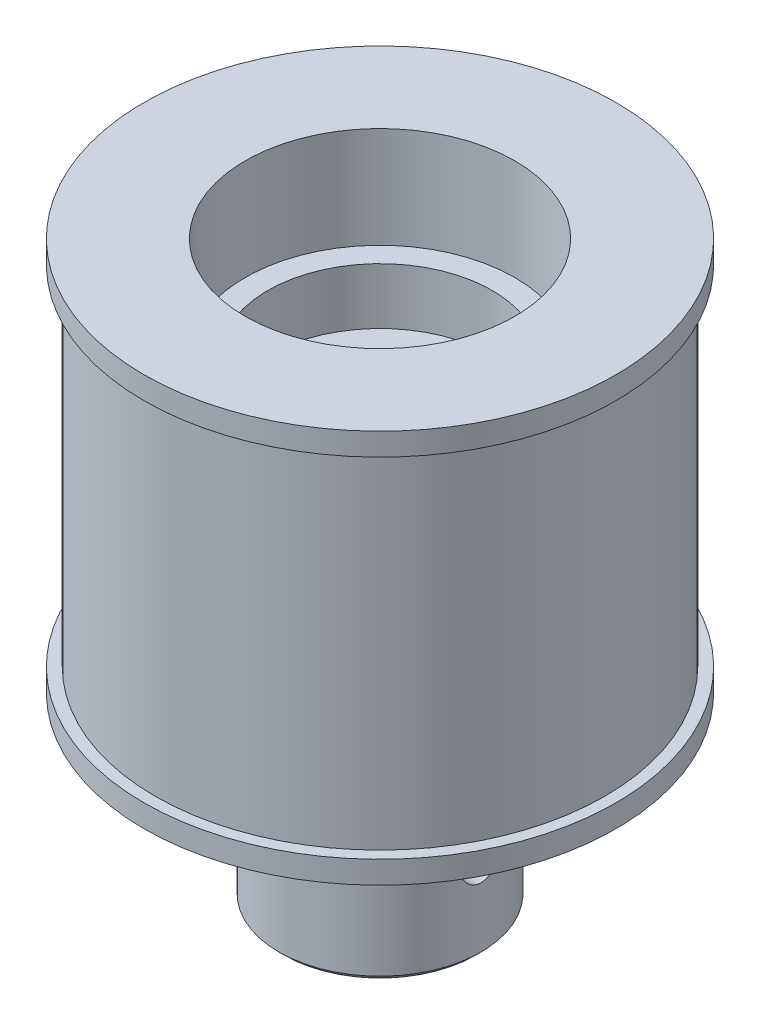
ISO-10303-21;
HEADER;
FILE_DESCRIPTION(('STEP AP214'),'2;1');
FILE_NAME('part.step','',(''),(''),'','','');
FILE_SCHEMA(('AUTOMOTIVE_DESIGN { 1 0 10303 214 1 1 1 1 }'));
ENDSEC;
DATA;
#1=APPLICATION_CONTEXT('core data for automotive mechanical design processes');
#2=APPLICATION_PROTOCOL_DEFINITION('international standard','automotive_design',2000,#1);
#3=PRODUCT_CONTEXT('',#1,'mechanical');
#4=PRODUCT('Part','Part','',(#3));
#5=PRODUCT_RELATED_PRODUCT_CATEGORY('part','',(#4));
#6=PRODUCT_DEFINITION_FORMATION('','',#4);
#7=PRODUCT_DEFINITION_CONTEXT('part definition',#1,'design');
#8=PRODUCT_DEFINITION('design','',#6,#7);
#9=PRODUCT_DEFINITION_SHAPE('','',#8);
#10=(LENGTH_UNIT() NAMED_UNIT(*) SI_UNIT(.MILLI.,.METRE.));
#11=(NAMED_UNIT(*) PLANE_ANGLE_UNIT() SI_UNIT($,.RADIAN.));
#12=(NAMED_UNIT(*) SI_UNIT($,.STERADIAN.) SOLID_ANGLE_UNIT());
#13=UNCERTAINTY_MEASURE_WITH_UNIT(LENGTH_MEASURE(1.E-05),#10,'distance_accuracy_value','');
#14=(GEOMETRIC_REPRESENTATION_CONTEXT(3) GLOBAL_UNCERTAINTY_ASSIGNED_CONTEXT((#13)) GLOBAL_UNIT_ASSIGNED_CONTEXT((#10,
#11,#12)) REPRESENTATION_CONTEXT('',''));
#15=CARTESIAN_POINT('',(0.,0.,0.));
#16=DIRECTION('',(0.,0.,1.));
#17=DIRECTION('',(1.,0.,0.));
#18=AXIS2_PLACEMENT_3D('',#15,#16,#17);
#19=CARTESIAN_POINT('',(3.70685397720562E-08,-63.6879775965787,3.94408852499265E-08));
#20=DIRECTION('',(0.,-1.,0.));
#21=DIRECTION('',(0.,0.,-1.));
#22=AXIS2_PLACEMENT_3D('',#19,#20,#21);
#23=CYLINDRICAL_SURFACE('',#22,7.99999999999998);
#24=CARTESIAN_POINT('',(7.28766084146934,-48.6879775965787,3.30000003944086));
#25=CARTESIAN_POINT('',(7.28766168684549,-48.5998412091458,3.29999912533101));
#26=CARTESIAN_POINT('',(7.28926702489455,-48.5116681297829,3.29646158001995));
#27=CARTESIAN_POINT('',(7.29562606450204,-48.3359838307674,3.28236025662656));
#28=CARTESIAN_POINT('',(7.30038184761695,-48.2484730874232,3.27179183309513));
#29=CARTESIAN_POINT('',(7.31919460655789,-47.9875669606284,3.22961619820375));
#30=CARTESIAN_POINT('',(7.33779634133791,-47.8160571252773,3.18753899617591));
#31=CARTESIAN_POINT('',(7.38462377085963,-47.4839281651399,3.07747096482155));
#32=CARTESIAN_POINT('',(7.41281071755744,-47.3232682659154,3.00958434122854));
#33=CARTESIAN_POINT('',(7.47556538066111,-47.0156257502108,2.85013069755427));
#34=CARTESIAN_POINT('',(7.51013149848159,-46.8686397209829,2.75856960786439));
#35=CARTESIAN_POINT('',(7.58411043022314,-46.5835168334857,2.548397180833));
#36=CARTESIAN_POINT('',(7.62368553340776,-46.4463181759618,2.42857040845044));
#37=CARTESIAN_POINT('',(7.70188736321158,-46.1932689621633,2.16782147856657));
#38=CARTESIAN_POINT('',(7.74051372355154,-46.077426541958,2.02689131822568));
#39=CARTESIAN_POINT('',(7.81443152134191,-45.8656345951317,1.72060392781853));
#40=CARTESIAN_POINT('',(7.84951236673556,-45.7707356619456,1.55446481998653));
#41=CARTESIAN_POINT('',(7.91040570382046,-45.6106373751258,1.20687276287427));
#42=CARTESIAN_POINT('',(7.93622223126295,-45.5454250859699,1.02542652438377));
#43=CARTESIAN_POINT('',(7.97452810355379,-45.4499361661065,0.662210384128631));
#44=CARTESIAN_POINT('',(7.98763132352917,-45.4180438961445,0.480931289830983));
#45=CARTESIAN_POINT('',(8.00126126858232,-45.3848842974542,0.115152749719518));
#46=CARTESIAN_POINT('',(8.00179298796317,-45.3836048071284,-0.069345388106527));
#47=CARTESIAN_POINT('',(7.99058452020967,-45.4108505877294,-0.424594722345897));
#48=CARTESIAN_POINT('',(7.97957470474195,-45.4376019637119,-0.595509291358458));
#49=CARTESIAN_POINT('',(7.94751855760714,-45.5171152317752,-0.930171651031102));
#50=CARTESIAN_POINT('',(7.92647148686588,-45.5698790392416,-1.09391891297067));
#51=CARTESIAN_POINT('',(7.87597819169302,-45.7005529199363,-1.41259117419297));
#52=CARTESIAN_POINT('',(7.84640898138566,-45.7788335764051,-1.56734392008314));
#53=CARTESIAN_POINT('',(7.78177531229409,-45.9579601549752,-1.86192094054493));
#54=CARTESIAN_POINT('',(7.74670892594815,-46.0588139975958,-2.00173994964075));
#55=CARTESIAN_POINT('',(7.67174270983388,-46.2883540746247,-2.27277057949669));
#56=CARTESIAN_POINT('',(7.6316763277963,-46.4184844183562,-2.40271488691971));
#57=CARTESIAN_POINT('',(7.5530628928937,-46.6987969292418,-2.63947672904125));
#58=CARTESIAN_POINT('',(7.51451640746516,-46.8489864951738,-2.74628569204907));
#59=CARTESIAN_POINT('',(7.44213217968692,-47.1711744036148,-2.93690675741546));
#60=CARTESIAN_POINT('',(7.40848219475641,-47.3437127397235,-3.01988354657748));
#61=CARTESIAN_POINT('',(7.35192773524196,-47.7020709391428,-3.15509012293198));
#62=CARTESIAN_POINT('',(7.32901575798925,-47.8878814242534,-3.20734138463683));
#63=CARTESIAN_POINT('',(7.29838187177342,-48.2548233870004,-3.27642636771665));
#64=CARTESIAN_POINT('',(7.28978226063255,-48.4354941989582,-3.29531134966309));
#65=CARTESIAN_POINT('',(7.28623964456051,-48.797588855962,-3.30314199400526));
#66=CARTESIAN_POINT('',(7.29129206918439,-48.9790124286936,-3.29209767616441));
#67=CARTESIAN_POINT('',(7.3135789244228,-49.325579614681,-3.24225417059817));
#68=CARTESIAN_POINT('',(7.33003611431017,-49.491033955929,-3.20522400293071));
#69=CARTESIAN_POINT('',(7.3722922953943,-49.8132517253374,-3.10679156579863));
#70=CARTESIAN_POINT('',(7.39809344131328,-49.9700131392808,-3.04538367450106));
#71=CARTESIAN_POINT('',(7.45744959423464,-50.2777356079711,-2.89707800465932));
#72=CARTESIAN_POINT('',(7.49128431808843,-50.4281779861409,-2.80921954672569));
#73=CARTESIAN_POINT('',(7.56249050086479,-50.7128979354344,-2.61146906874681));
#74=CARTESIAN_POINT('',(7.59986346482042,-50.8471685720353,-2.50156765002805));
#75=CARTESIAN_POINT('',(7.67752027048328,-51.1068368494868,-2.25255080380618));
#76=CARTESIAN_POINT('',(7.71779938142686,-51.230681070733,-2.11180770311287));
#77=CARTESIAN_POINT('',(7.79396233315651,-51.4532633078459,-1.81059592069962));
#78=CARTESIAN_POINT('',(7.82984588967138,-51.5519997003721,-1.65012596453925));
#79=CARTESIAN_POINT('',(7.89337538492814,-51.7213858652055,-1.31303359439945));
#80=CARTESIAN_POINT('',(7.92100631665157,-51.791984547381,-1.1363825085758));
#81=CARTESIAN_POINT('',(7.96474211940721,-51.9019609094997,-0.77228162749393));
#82=CARTESIAN_POINT('',(7.98085369785974,-51.9413567594847,-0.584838185166113));
#83=CARTESIAN_POINT('',(7.99897789724173,-51.9855540571871,-0.218374340606245));
#84=CARTESIAN_POINT('',(8.00188350658962,-51.9925472640615,-0.039660580255623));
#85=CARTESIAN_POINT('',(7.99572444083135,-51.9776067178408,0.316323521290345));
#86=CARTESIAN_POINT('',(7.98666179117198,-51.9556778593688,0.493594101614116));
#87=CARTESIAN_POINT('',(7.9580483374852,-51.8850883482519,0.835410778877292));
#88=CARTESIAN_POINT('',(7.938867329054,-51.8373688443411,1.00018473703276));
#89=CARTESIAN_POINT('',(7.892109641997,-51.7175692348018,1.31933479658177));
#90=CARTESIAN_POINT('',(7.86453135250536,-51.6454844548453,1.47370889600611));
#91=CARTESIAN_POINT('',(7.8021162595224,-51.4753690575081,1.775322128978));
#92=CARTESIAN_POINT('',(7.76700871637184,-51.3763170423559,1.92192779031539));
#93=CARTESIAN_POINT('',(7.69371402925846,-51.1565699429651,2.19705936094854));
#94=CARTESIAN_POINT('',(7.6555257731865,-51.0358670235366,2.32557869488281));
#95=CARTESIAN_POINT('',(7.57719566284719,-50.7668103556422,2.56975273508921));
#96=CARTESIAN_POINT('',(7.53709262648674,-50.617152147218,2.68398499729813));
#97=CARTESIAN_POINT('',(7.46210533098938,-50.2994155646953,2.88593993938718));
#98=CARTESIAN_POINT('',(7.42722396163788,-50.1313270793633,2.97364796736153));
#99=CARTESIAN_POINT('',(7.38230252025306,-49.8694101079418,3.08271465035157));
#100=CARTESIAN_POINT('',(7.36858886721319,-49.7807224037907,3.11526403705097));
#101=CARTESIAN_POINT('',(7.34403273115054,-49.6005337974875,3.17272203759876));
#102=CARTESIAN_POINT('',(7.33318884586417,-49.5090342937598,3.19763438410395));
#103=CARTESIAN_POINT('',(7.31479998694532,-49.3241699185096,3.23947881547502));
#104=CARTESIAN_POINT('',(7.30724629946075,-49.2308106675112,3.2564319890333));
#105=CARTESIAN_POINT('',(7.29569187595335,-49.0428088313693,3.28223758836641));
#106=CARTESIAN_POINT('',(7.29168836222304,-48.9481673084663,3.29109634749383));
#107=CARTESIAN_POINT('',(7.28891154033444,-48.8257883124827,3.297236697422));
#108=CARTESIAN_POINT('',(7.28844283465011,-48.798239490268,3.29827264797827));
#109=CARTESIAN_POINT('',(7.28781735185684,-48.7431208413996,3.29965446446151));
#110=CARTESIAN_POINT('',(7.2876605769939,-48.7155510145961,3.3000003254196));
#111=CARTESIAN_POINT('',(7.28766084146934,-48.6879775965787,3.30000003944086));
#112=B_SPLINE_CURVE_WITH_KNOTS('',3,(#24,#25,#26,#27,#28,#29,#30,#31,#32,#33,#34,#35,#36,#37,
#38,#39,#40,#41,#42,#43,#44,#45,#46,#47,#48,#49,#50,#51,#52,#53,#54,#55,#56,#57,#58,#59,#60,#61,
#62,#63,#64,#65,#66,#67,#68,#69,#70,#71,#72,#73,#74,#75,#76,#77,#78,#79,#80,#81,#82,#83,#84,#85,
#86,#87,#88,#89,#90,#91,#92,#93,#94,#95,#96,#97,#98,#99,#100,#101,#102,#103,#104,#105,#106,#107,
#108,#109,#110,#111),.UNSPECIFIED.,.T.,.F.,(4,2,2,2,2,2,2,2,2,2,2,2,2,2,2,2,2,2,2,2,2,2,2,2,2,2,
2,2,2,2,2,2,2,2,2,2,2,2,2,2,2,2,2,4),(0.,0.26437796609069,0.528930785979015,1.0588042546947,
1.58656069240161,2.11418505637261,2.67097328187332,3.22797319018168,3.80856885855565,
4.38891129811146,4.93958366154288,5.49003725467795,6.00764527305279,6.52529141039329,
7.05081787515226,7.57652902744837,8.13865959961875,8.70099808737194,9.28114346214908,
9.86088288157655,10.4035480507196,10.9460315682752,11.4547737572776,11.9636333373319,
12.4938256760685,13.0242445605368,13.5968210824413,14.1694346147316,14.7430831658777,
15.3163974237373,15.8503041672759,16.384120566753,16.8996563852295,17.4152911622621,
17.9541243838482,18.4931529972604,19.0680018488106,19.6431676674999,19.9292334658526,
20.2151592238064,20.5003230541709,20.7852635708517,20.8679734696513,20.9506839639879),.UNSPECIFIED.);
#113=CARTESIAN_POINT('',(7.28766084146934,-48.6879775965787,3.30000003944086));
#114=VERTEX_POINT('',#113);
#115=EDGE_CURVE('E60',#114,#114,#112,.T.);
#116=ORIENTED_EDGE('',*,*,#115,.F.);
#117=EDGE_LOOP('',(#116));
#118=FACE_BOUND('',#117,.T.);
#119=CARTESIAN_POINT('',(-7.28766076733226,-48.6879775965787,3.30000003944086));
#120=CARTESIAN_POINT('',(-7.28766161270841,-48.7761139840115,3.29999912533101));
#121=CARTESIAN_POINT('',(-7.28926695075747,-48.8642870633745,3.29646158001995));
#122=CARTESIAN_POINT('',(-7.29562599036496,-49.0399713623899,3.28236025662656));
#123=CARTESIAN_POINT('',(-7.30038177347987,-49.1274821057341,3.27179183309514));
#124=CARTESIAN_POINT('',(-7.31919453242081,-49.3883882325289,3.22961619820375));
#125=CARTESIAN_POINT('',(-7.33779626720083,-49.5598980678801,3.18753899617591));
#126=CARTESIAN_POINT('',(-7.38462369672255,-49.8920270280174,3.07747096482155));
#127=CARTESIAN_POINT('',(-7.41281064342036,-50.052686927242,3.00958434122854));
#128=CARTESIAN_POINT('',(-7.47556530652403,-50.3603294429465,2.85013069755427));
#129=CARTESIAN_POINT('',(-7.51013142434451,-50.5073154721744,2.75856960786439));
#130=CARTESIAN_POINT('',(-7.58411035608606,-50.7924383596717,2.548397180833));
#131=CARTESIAN_POINT('',(-7.62368545927068,-50.9296370171956,2.42857040845044));
#132=CARTESIAN_POINT('',(-7.7018872890745,-51.1826862309941,2.16782147856657));
#133=CARTESIAN_POINT('',(-7.74051364941446,-51.2985286511994,2.02689131822568));
#134=CARTESIAN_POINT('',(-7.81443144720483,-51.5103205980256,1.72060392781853));
#135=CARTESIAN_POINT('',(-7.84951229259848,-51.6052195312117,1.55446481998653));
#136=CARTESIAN_POINT('',(-7.91040562968338,-51.7653178180315,1.20687276287427));
#137=CARTESIAN_POINT('',(-7.93622215712587,-51.8305301071875,1.02542652438377));
#138=CARTESIAN_POINT('',(-7.97452802941671,-51.9260190270508,0.662210384128631));
#139=CARTESIAN_POINT('',(-7.98763124939209,-51.9579112970128,0.480931289830983));
#140=CARTESIAN_POINT('',(-8.00126119444524,-51.9910708957031,0.115152749719518));
#141=CARTESIAN_POINT('',(-8.00179291382609,-51.992350386029,-0.0693453881065269));
#142=CARTESIAN_POINT('',(-7.99058444607259,-51.9651046054279,-0.424594722345897));
#143=CARTESIAN_POINT('',(-7.97957463060488,-51.9383532294455,-0.595509291358459));
#144=CARTESIAN_POINT('',(-7.94751848347006,-51.8588399613821,-0.930171651031103));
#145=CARTESIAN_POINT('',(-7.92647141272881,-51.8060761539158,-1.09391891297067));
#146=CARTESIAN_POINT('',(-7.87597811755594,-51.6754022732211,-1.41259117419297));
#147=CARTESIAN_POINT('',(-7.84640890724858,-51.5971216167522,-1.56734392008314));
#148=CARTESIAN_POINT('',(-7.78177523815701,-51.4179950381821,-1.86192094054493));
#149=CARTESIAN_POINT('',(-7.74670885181107,-51.3171411955615,-2.00173994964075));
#150=CARTESIAN_POINT('',(-7.6717426356968,-51.0876011185327,-2.27277057949669));
#151=CARTESIAN_POINT('',(-7.63167625365922,-50.9574707748012,-2.40271488691971));
#152=CARTESIAN_POINT('',(-7.55306281875662,-50.6771582639156,-2.63947672904125));
#153=CARTESIAN_POINT('',(-7.51451633332808,-50.5269686979835,-2.74628569204907));
#154=CARTESIAN_POINT('',(-7.44213210554984,-50.2047807895426,-2.93690675741546));
#155=CARTESIAN_POINT('',(-7.40848212061933,-50.0322424534338,-3.01988354657748));
#156=CARTESIAN_POINT('',(-7.35192766110488,-49.6738842540145,-3.15509012293198));
#157=CARTESIAN_POINT('',(-7.32901568385217,-49.488073768904,-3.20734138463683));
#158=CARTESIAN_POINT('',(-7.29838179763634,-49.1211318061569,-3.27642636771665));
#159=CARTESIAN_POINT('',(-7.28978218649547,-48.9404609941991,-3.29531134966309));
#160=CARTESIAN_POINT('',(-7.28623957042343,-48.5783663371953,-3.30314199400526));
#161=CARTESIAN_POINT('',(-7.29129199504731,-48.3969427644638,-3.29209767616441));
#162=CARTESIAN_POINT('',(-7.31357885028572,-48.0503755784763,-3.24225417059817));
#163=CARTESIAN_POINT('',(-7.33003604017309,-47.8849212372283,-3.20522400293071));
#164=CARTESIAN_POINT('',(-7.37229222125722,-47.5627034678199,-3.10679156579863));
#165=CARTESIAN_POINT('',(-7.3980933671762,-47.4059420538765,-3.04538367450106));
#166=CARTESIAN_POINT('',(-7.45744952009755,-47.0982195851862,-2.89707800465932));
#167=CARTESIAN_POINT('',(-7.49128424395135,-46.9477772070165,-2.80921954672569));
#168=CARTESIAN_POINT('',(-7.56249042672771,-46.6630572577229,-2.61146906874681));
#169=CARTESIAN_POINT('',(-7.59986339068334,-46.5287866211221,-2.50156765002804));
#170=CARTESIAN_POINT('',(-7.6775201963462,-46.2691183436705,-2.25255080380618));
#171=CARTESIAN_POINT('',(-7.71779930728979,-46.1452741224243,-2.11180770311287));
#172=CARTESIAN_POINT('',(-7.79396225901943,-45.9226918853115,-1.81059592069962));
#173=CARTESIAN_POINT('',(-7.8298458155343,-45.8239554927852,-1.65012596453925));
#174=CARTESIAN_POINT('',(-7.89337531079106,-45.6545693279518,-1.31303359439945));
#175=CARTESIAN_POINT('',(-7.92100624251449,-45.5839706457763,-1.1363825085758));
#176=CARTESIAN_POINT('',(-7.96474204527013,-45.4739942836577,-0.77228162749393));
#177=CARTESIAN_POINT('',(-7.98085362372266,-45.4345984336726,-0.584838185166113));
#178=CARTESIAN_POINT('',(-7.99897782310465,-45.3904011359702,-0.218374340606244));
#179=CARTESIAN_POINT('',(-8.00188343245254,-45.3834079290959,-0.0396605802556225));
#180=CARTESIAN_POINT('',(-7.99572436669427,-45.3983484753165,0.316323521290345));
#181=CARTESIAN_POINT('',(-7.9866617170349,-45.4202773337886,0.493594101614117));
#182=CARTESIAN_POINT('',(-7.95804826334813,-45.4908668449054,0.835410778877292));
#183=CARTESIAN_POINT('',(-7.93886725491692,-45.5385863488163,1.00018473703276));
#184=CARTESIAN_POINT('',(-7.89210956785992,-45.6583859583555,1.31933479658177));
#185=CARTESIAN_POINT('',(-7.86453127836828,-45.730470738312,1.47370889600611));
#186=CARTESIAN_POINT('',(-7.80211618538532,-45.9005861356492,1.775322128978));
#187=CARTESIAN_POINT('',(-7.76700864223476,-45.9996381508015,1.92192779031538));
#188=CARTESIAN_POINT('',(-7.69371395512138,-46.2193852501923,2.19705936094854));
#189=CARTESIAN_POINT('',(-7.65552569904942,-46.3400881696208,2.32557869488281));
#190=CARTESIAN_POINT('',(-7.57719558871011,-46.6091448375151,2.56975273508921));
#191=CARTESIAN_POINT('',(-7.53709255234966,-46.7588030459394,2.68398499729813));
#192=CARTESIAN_POINT('',(-7.4621052568523,-47.076539628462,2.88593993938718));
#193=CARTESIAN_POINT('',(-7.4272238875008,-47.244628113794,2.97364796736153));
#194=CARTESIAN_POINT('',(-7.38230244611598,-47.5065450852155,3.08271465035157));
#195=CARTESIAN_POINT('',(-7.36858879307611,-47.5952327893666,3.11526403705097));
#196=CARTESIAN_POINT('',(-7.34403265701346,-47.7754213956698,3.17272203759876));
#197=CARTESIAN_POINT('',(-7.33318877172709,-47.8669208993976,3.19763438410395));
#198=CARTESIAN_POINT('',(-7.31479991280824,-48.0517852746477,3.23947881547502));
#199=CARTESIAN_POINT('',(-7.30724622532367,-48.1451445256461,3.2564319890333));
#200=CARTESIAN_POINT('',(-7.29569180181627,-48.3331463617881,3.28223758836641));
#201=CARTESIAN_POINT('',(-7.29168828808596,-48.427787884691,3.29109634749383));
#202=CARTESIAN_POINT('',(-7.28891146619736,-48.5501668806746,3.297236697422));
#203=CARTESIAN_POINT('',(-7.28844276051303,-48.5777157028893,3.29827264797827));
#204=CARTESIAN_POINT('',(-7.28781727771975,-48.6328343517578,3.29965446446151));
#205=CARTESIAN_POINT('',(-7.28766050285682,-48.6604041785613,3.3000003254196));
#206=CARTESIAN_POINT('',(-7.28766076733226,-48.6879775965787,3.30000003944086));
#207=B_SPLINE_CURVE_WITH_KNOTS('',3,(#119,#120,#121,#122,#123,#124,#125,#126,#127,#128,#129,
#130,#131,#132,#133,#134,#135,#136,#137,#138,#139,#140,#141,#142,#143,#144,#145,#146,#147,#148,
#149,#150,#151,#152,#153,#154,#155,#156,#157,#158,#159,#160,#161,#162,#163,#164,#165,#166,#167,
#168,#169,#170,#171,#172,#173,#174,#175,#176,#177,#178,#179,#180,#181,#182,#183,#184,#185,#186,
#187,#188,#189,#190,#191,#192,#193,#194,#195,#196,#197,#198,#199,#200,#201,#202,#203,#204,#205,
#206),.UNSPECIFIED.,.T.,.F.,(4,2,2,2,2,2,2,2,2,2,2,2,2,2,2,2,2,2,2,2,2,2,2,2,2,2,2,2,2,2,2,2,2,
2,2,2,2,2,2,2,2,2,2,4),(0.,0.264377966090676,0.528930785979001,1.0588042546947,1.58656069240161,
2.11418505637261,2.67097328187332,3.22797319018168,3.80856885855565,4.38891129811146,
4.93958366154288,5.49003725467795,6.00764527305279,6.52529141039329,7.05081787515226,
7.57652902744837,8.13865959961875,8.70099808737194,9.28114346214908,9.86088288157655,
10.4035480507196,10.9460315682752,11.4547737572776,11.963633337332,12.4938256760685,
13.0242445605368,13.5968210824413,14.1694346147316,14.7430831658777,15.3163974237373,
15.8503041672759,16.384120566753,16.8996563852295,17.4152911622621,17.9541243838482,
18.4931529972604,19.0680018488106,19.6431676674999,19.9292334658526,20.2151592238064,
20.5003230541709,20.7852635708517,20.8679734696513,20.9506839639879),.UNSPECIFIED.);
#208=CARTESIAN_POINT('',(-7.28766076733226,-48.6879775965787,3.30000003944086));
#209=VERTEX_POINT('',#208);
#210=EDGE_CURVE('E68',#209,#209,#207,.T.);
#211=ORIENTED_EDGE('',*,*,#210,.F.);
#212=EDGE_LOOP('',(#211));
#213=FACE_BOUND('',#212,.T.);
#214=CARTESIAN_POINT('',(3.70685397720562E-08,-62.6879775965787,3.94408852499265E-08));
#215=DIRECTION('',(0.,-1.,0.));
#216=DIRECTION('',(0.,0.,-1.));
#217=AXIS2_PLACEMENT_3D('',#214,#215,#216);
#218=CIRCLE('',#217,7.99999999999998);
#219=CARTESIAN_POINT('',(3.70685397720562E-08,-62.6879775965787,-7.99999996055909));
#220=VERTEX_POINT('',#219);
#221=EDGE_CURVE('E56',#220,#220,#218,.T.);
#222=ORIENTED_EDGE('',*,*,#221,.T.);
#223=EDGE_LOOP('',(#222));
#224=FACE_BOUND('',#223,.T.);
#225=CARTESIAN_POINT('',(3.70685397720562E-08,10.3120224034213,3.94408852499265E-08));
#226=DIRECTION('',(0.,1.,0.));
#227=DIRECTION('',(0.,0.,1.));
#228=AXIS2_PLACEMENT_3D('',#225,#226,#227);
#229=CIRCLE('',#228,7.99999999999998);
#230=CARTESIAN_POINT('',(3.70685397720562E-08,10.3120224034213,8.00000003944086));
#231=VERTEX_POINT('',#230);
#232=EDGE_CURVE('E43',#231,#231,#229,.F.);
#233=ORIENTED_EDGE('',*,*,#232,.F.);
#234=EDGE_LOOP('',(#233));
#235=FACE_BOUND('',#234,.T.);
#236=ADVANCED_FACE('F39',(#118,#213,#224,#235),#23,.F.);
#237=CARTESIAN_POINT('',(-87.2333386358344,-48.6879775965787,3.94408852499265E-08));
#238=DIRECTION('',(-1.,0.,0.));
#239=DIRECTION('',(0.,0.,1.));
#240=AXIS2_PLACEMENT_3D('',#237,#238,#239);
#241=CYLINDRICAL_SURFACE('',#240,3.29999999999998);
#242=ORIENTED_EDGE('',*,*,#115,.T.);
#243=EDGE_LOOP('',(#242));
#244=FACE_BOUND('',#243,.T.);
#245=CARTESIAN_POINT('',(17.6949145607389,-48.6879775965787,3.30000003944086));
#246=CARTESIAN_POINT('',(17.6949180749467,-48.5042941629642,3.29999291828668));
#247=CARTESIAN_POINT('',(17.6978057168288,-48.3205174508536,3.28461184258262));
#248=CARTESIAN_POINT('',(17.7090307113766,-47.9581407240295,3.22353231373032));
#249=CARTESIAN_POINT('',(17.7173727710361,-47.7795453197758,3.17780767451579));
#250=CARTESIAN_POINT('',(17.7385307639654,-47.4328271452147,3.05748789212024));
#251=CARTESIAN_POINT('',(17.7513426185429,-47.264694991441,2.98291906256927));
#252=CARTESIAN_POINT('',(17.7799918035156,-46.9433396642452,2.80709651430073));
#253=CARTESIAN_POINT('',(17.7958288761273,-46.7901152221919,2.70584506897105));
#254=CARTESIAN_POINT('',(17.8289546327218,-46.5010881033218,2.4782466309118));
#255=CARTESIAN_POINT('',(17.8462569958272,-46.3654886397261,2.35164353068142));
#256=CARTESIAN_POINT('',(17.8802428342595,-46.1173300543037,2.07748910449728));
#257=CARTESIAN_POINT('',(17.8969262697498,-46.0047724134416,1.92993643308564));
#258=CARTESIAN_POINT('',(17.9279406702824,-45.805117117726,1.61674022785813));
#259=CARTESIAN_POINT('',(17.9422536459368,-45.7182105598446,1.45097294035575));
#260=CARTESIAN_POINT('',(17.9667615083072,-45.573554957523,1.10688483397155));
#261=CARTESIAN_POINT('',(17.976956718691,-45.5158036213113,0.928565003049207));
#262=CARTESIAN_POINT('',(17.9919837179642,-45.4317248040995,0.56653828801584));
#263=CARTESIAN_POINT('',(17.9968738986674,-45.4050549650303,0.382913378451864));
#264=CARTESIAN_POINT('',(18.0009409768761,-45.3828299131646,0.0137345619020261));
#265=CARTESIAN_POINT('',(18.0001183403922,-45.3872721624684,-0.171819186510143));
#266=CARTESIAN_POINT('',(17.9928982278817,-45.4268816980366,-0.537242112820622));
#267=CARTESIAN_POINT('',(17.9865676329446,-45.4616803906076,-0.717152755907168));
#268=CARTESIAN_POINT('',(17.969117819197,-45.5604325793799,-1.06853722884088));
#269=CARTESIAN_POINT('',(17.9579984316032,-45.6243871031968,-1.24001076108074));
#270=CARTESIAN_POINT('',(17.9321081713838,-45.7799898618053,-1.57072829257839));
#271=CARTESIAN_POINT('',(17.917317825491,-45.8717863855525,-1.72990093511656));
#272=CARTESIAN_POINT('',(17.8857229153622,-46.0803582497431,-2.03072114646645));
#273=CARTESIAN_POINT('',(17.8689181550399,-46.1971360227724,-2.17236700646029));
#274=CARTESIAN_POINT('',(17.8348665055433,-46.4543894556154,-2.43629551506219));
#275=CARTESIAN_POINT('',(17.817616746619,-46.5951875306018,-2.55826373932653));
#276=CARTESIAN_POINT('',(17.7848554016286,-46.8954082499162,-2.77690086852963));
#277=CARTESIAN_POINT('',(17.7693438388382,-47.0548311435854,-2.87356943471118));
#278=CARTESIAN_POINT('',(17.7418115136186,-47.388181986961,-3.03894694954119));
#279=CARTESIAN_POINT('',(17.7297962591887,-47.5621322739435,-3.10761184948394));
#280=CARTESIAN_POINT('',(17.7107025841817,-47.919369714965,-3.21465404664483));
#281=CARTESIAN_POINT('',(17.7036236306697,-48.1026558587891,-3.25303461349081));
#282=CARTESIAN_POINT('',(17.6953090396132,-48.4705314927247,-3.2979630155672));
#283=CARTESIAN_POINT('',(17.6939906229817,-48.6550640878887,-3.3049618459968));
#284=CARTESIAN_POINT('',(17.6971250816561,-49.0226616691232,-3.28813556621438));
#285=CARTESIAN_POINT('',(17.7015776847566,-49.2057267240042,-3.26431190982645));
#286=CARTESIAN_POINT('',(17.7156755092993,-49.5637205138194,-3.18690354862873));
#287=CARTESIAN_POINT('',(17.7252797125559,-49.7387018196887,-3.13355383162204));
#288=CARTESIAN_POINT('',(17.7485634416195,-50.0772416582391,-2.99885647783831));
#289=CARTESIAN_POINT('',(17.7622432562055,-50.2407993804836,-2.91750685705345));
#290=CARTESIAN_POINT('',(17.7923261483781,-50.5538403522679,-2.72807541504294));
#291=CARTESIAN_POINT('',(17.8087576770316,-50.7031478935847,-2.61970783369335));
#292=CARTESIAN_POINT('',(17.8424118956867,-50.9816222884698,-2.37970339200737));
#293=CARTESIAN_POINT('',(17.8596346534661,-51.1107874124333,-2.24806453546351));
#294=CARTESIAN_POINT('',(17.8931959026866,-51.3469873910588,-1.96324335333799));
#295=CARTESIAN_POINT('',(17.9095203392852,-51.45371945872,-1.80980801374697));
#296=CARTESIAN_POINT('',(17.9392115209406,-51.6398900312872,-1.48692200582497));
#297=CARTESIAN_POINT('',(17.9525783762912,-51.7193295540451,-1.31747193505006));
#298=CARTESIAN_POINT('',(17.974787735735,-51.8482030055061,-0.968216208371406));
#299=CARTESIAN_POINT('',(17.9836529303911,-51.8977876572834,-0.7884676743427));
#300=CARTESIAN_POINT('',(17.9959567207086,-51.9660258346129,-0.423016748132555));
#301=CARTESIAN_POINT('',(17.9993958611637,-51.9846824654498,-0.237314955588372));
#302=CARTESIAN_POINT('',(18.0004498670329,-51.9904307997701,0.131863529165206));
#303=CARTESIAN_POINT('',(17.9981492428268,-51.9779805072897,0.315333006617252));
#304=CARTESIAN_POINT('',(17.9881571804355,-51.9228689112089,0.677519200290667));
#305=CARTESIAN_POINT('',(17.980465789118,-51.8802078702628,0.85623595781848));
#306=CARTESIAN_POINT('',(17.9605555893638,-51.7660752634161,1.20361547262083));
#307=CARTESIAN_POINT('',(17.9483441255771,-51.6946504192464,1.37229402763923));
#308=CARTESIAN_POINT('',(17.9207179951752,-51.5250717173891,1.69534160832718));
#309=CARTESIAN_POINT('',(17.9053031267064,-51.4269161752205,1.84970973137818));
#310=CARTESIAN_POINT('',(17.8727058671661,-51.2050758925448,2.1420421719925));
#311=CARTESIAN_POINT('',(17.8555021222579,-51.0810592815129,2.27975229309195));
#312=CARTESIAN_POINT('',(17.8214035017131,-50.8117077952557,2.53256639629511));
#313=CARTESIAN_POINT('',(17.8045086995613,-50.6663679204202,2.64766506190527));
#314=CARTESIAN_POINT('',(17.7727791014693,-50.3569703556402,2.85293492948195));
#315=CARTESIAN_POINT('',(17.7579637008451,-50.192759485676,2.94287832615877));
#316=CARTESIAN_POINT('',(17.7323027423469,-49.8513424700398,3.09375930625423));
#317=CARTESIAN_POINT('',(17.7214533934317,-49.6741489297116,3.15472460587929));
#318=CARTESIAN_POINT('',(17.7072455492549,-49.3616593134426,3.23334925224809));
#319=CARTESIAN_POINT('',(17.7026485167184,-49.228206720412,3.25830104493815));
#320=CARTESIAN_POINT('',(17.6964817631122,-48.9591788662646,3.29162885925668));
#321=CARTESIAN_POINT('',(17.6949119659585,-48.8236036585822,3.30000529747682));
#322=CARTESIAN_POINT('',(17.6949145607389,-48.6879775965787,3.30000003944086));
#323=B_SPLINE_CURVE_WITH_KNOTS('',3,(#245,#246,#247,#248,#249,#250,#251,#252,#253,#254,#255,
#256,#257,#258,#259,#260,#261,#262,#263,#264,#265,#266,#267,#268,#269,#270,#271,#272,#273,#274,
#275,#276,#277,#278,#279,#280,#281,#282,#283,#284,#285,#286,#287,#288,#289,#290,#291,#292,#293,
#294,#295,#296,#297,#298,#299,#300,#301,#302,#303,#304,#305,#306,#307,#308,#309,#310,#311,#312,
#313,#314,#315,#316,#317,#318,#319,#320,#321,#322),.UNSPECIFIED.,.T.,.F.,(4,2,2,2,2,2,2,2,2,2,2,
2,2,2,2,2,2,2,2,2,2,2,2,2,2,2,2,2,2,2,2,2,2,2,2,2,2,2,4),(0.,0.550554054494691,1.10158384829148,
1.65211213633202,2.20259353392008,2.75894533685623,3.31533288691051,3.87576648070734,
4.43615601427381,4.99031278896093,5.544424360063,6.0919000073975,6.63939495234766,
7.18985869461928,7.74037606352445,8.29896677373961,8.85756496298654,9.41703844825006,
9.97645152206352,10.5277988074376,11.0791200880072,11.6261154083622,12.1731494955105,
12.7262349417551,13.2793678546509,13.8395451326235,14.3997015170029,14.9570056937773,
15.5142539118155,16.0633459531333,16.6124332206673,17.1606321670847,17.7088656672008,
18.2646230092088,18.8205108670647,19.3812808515903,19.9415134009551,20.3480353916191,
20.7545471649558),.UNSPECIFIED.);
#324=CARTESIAN_POINT('',(17.6949145607389,-48.6879775965787,3.30000003944086));
#325=VERTEX_POINT('',#324);
#326=EDGE_CURVE('E113',#325,#325,#323,.T.);
#327=ORIENTED_EDGE('',*,*,#326,.F.);
#328=EDGE_LOOP('',(#327));
#329=FACE_BOUND('',#328,.T.);
#330=ADVANCED_FACE('F78',(#244,#329),#241,.F.);
#331=CARTESIAN_POINT('',(3.70685397720562E-08,-31.6879775965787,3.94408852499265E-08));
#332=DIRECTION('',(0.,1.,0.));
#333=DIRECTION('',(0.,0.,1.));
#334=AXIS2_PLACEMENT_3D('',#331,#332,#333);
#335=PLANE('',#334);
#336=CARTESIAN_POINT('',(3.70685397720562E-08,-31.6879775965787,3.94408852499265E-08));
#337=DIRECTION('',(0.,1.,0.));
#338=DIRECTION('',(0.,0.,1.));
#339=AXIS2_PLACEMENT_3D('',#336,#337,#338);
#340=CIRCLE('',#339,42.);
#341=CARTESIAN_POINT('',(3.70685397720562E-08,-31.6879775965787,42.0000000394409));
#342=VERTEX_POINT('',#341);
#343=EDGE_CURVE('E125',#342,#342,#340,.T.);
#344=ORIENTED_EDGE('',*,*,#343,.F.);
#345=EDGE_LOOP('',(#344));
#346=FACE_BOUND('',#345,.T.);
#347=CARTESIAN_POINT('',(3.70685397720562E-08,-31.6879775965787,3.94408852499265E-08));
#348=DIRECTION('',(0.,1.,0.));
#349=DIRECTION('',(0.,0.,1.));
#350=AXIS2_PLACEMENT_3D('',#347,#348,#349);
#351=CIRCLE('',#350,18.);
#352=CARTESIAN_POINT('',(3.70685397720562E-08,-31.6879775965787,18.0000000394409));
#353=VERTEX_POINT('',#352);
#354=EDGE_CURVE('E59',#353,#353,#351,.F.);
#355=ORIENTED_EDGE('',*,*,#354,.F.);
#356=EDGE_LOOP('',(#355));
#357=FACE_BOUND('',#356,.T.);
#358=ADVANCED_FACE('F171',(#346,#357),#335,.F.);
#359=CARTESIAN_POINT('',(3.70685397720562E-08,38.3120224034213,3.94408852499265E-08));
#360=DIRECTION('',(0.,-1.,0.));
#361=DIRECTION('',(0.,0.,-1.));
#362=AXIS2_PLACEMENT_3D('',#359,#360,#361);
#363=CYLINDRICAL_SURFACE('',#362,42.);
#364=CARTESIAN_POINT('',(3.70685397720562E-08,38.3120224034213,3.94408852499265E-08));
#365=DIRECTION('',(0.,1.,0.));
#366=DIRECTION('',(0.,0.,1.));
#367=AXIS2_PLACEMENT_3D('',#364,#365,#366);
#368=CIRCLE('',#367,42.);
#369=CARTESIAN_POINT('',(3.70685397720562E-08,38.3120224034213,42.0000000394409));
#370=VERTEX_POINT('',#369);
#371=EDGE_CURVE('E126',#370,#370,#368,.T.);
#372=ORIENTED_EDGE('',*,*,#371,.F.);
#373=EDGE_LOOP('',(#372));
#374=FACE_BOUND('',#373,.T.);
#375=CARTESIAN_POINT('',(3.70685397720562E-08,34.3120224034213,3.94408852499265E-08));
#376=DIRECTION('',(0.,1.,0.));
#377=DIRECTION('',(0.,0.,1.));
#378=AXIS2_PLACEMENT_3D('',#375,#376,#377);
#379=CIRCLE('',#378,42.);
#380=CARTESIAN_POINT('',(3.70685397720562E-08,34.3120224034213,42.0000000394409));
#381=VERTEX_POINT('',#380);
#382=EDGE_CURVE('E122',#381,#381,#379,.T.);
#383=ORIENTED_EDGE('',*,*,#382,.T.);
#384=EDGE_LOOP('',(#383));
#385=FACE_BOUND('',#384,.T.);
#386=ADVANCED_FACE('F169',(#374,#385),#363,.T.);
#387=CARTESIAN_POINT('',(3.70685397720562E-08,38.3120224034213,3.94408852499265E-08));
#388=DIRECTION('',(0.,1.,0.));
#389=DIRECTION('',(0.,0.,1.));
#390=AXIS2_PLACEMENT_3D('',#387,#388,#389);
#391=PLANE('',#390);
#392=CARTESIAN_POINT('',(3.70685397720562E-08,38.3120224034213,3.94408852499265E-08));
#393=DIRECTION('',(0.,1.,0.));
#394=DIRECTION('',(0.,0.,1.));
#395=AXIS2_PLACEMENT_3D('',#392,#393,#394);
#396=CIRCLE('',#395,24.);
#397=CARTESIAN_POINT('',(3.70685397720562E-08,38.3120224034213,24.0000000394409));
#398=VERTEX_POINT('',#397);
#399=EDGE_CURVE('E110',#398,#398,#396,.T.);
#400=ORIENTED_EDGE('',*,*,#399,.F.);
#401=EDGE_LOOP('',(#400));
#402=FACE_BOUND('',#401,.T.);
#403=ORIENTED_EDGE('',*,*,#371,.T.);
#404=EDGE_LOOP('',(#403));
#405=FACE_BOUND('',#404,.T.);
#406=ADVANCED_FACE('F165',(#402,#405),#391,.T.);
#407=CARTESIAN_POINT('',(42.0000000370685,34.3120224034213,3.94408852499265E-08));
#408=DIRECTION('',(0.,-1.,0.));
#409=DIRECTION('',(0.,0.,-1.));
#410=AXIS2_PLACEMENT_3D('',#407,#408,#409);
#411=PLANE('',#410);
#412=CARTESIAN_POINT('',(3.70685397720562E-08,34.3120224034213,3.94408852499265E-08));
#413=DIRECTION('',(0.,1.,0.));
#414=DIRECTION('',(0.,0.,1.));
#415=AXIS2_PLACEMENT_3D('',#412,#413,#414);
#416=CIRCLE('',#415,40.);
#417=CARTESIAN_POINT('',(3.70685397720562E-08,34.3120224034213,40.0000000394409));
#418=VERTEX_POINT('',#417);
#419=EDGE_CURVE('E119',#418,#418,#416,.T.);
#420=ORIENTED_EDGE('',*,*,#419,.T.);
#421=EDGE_LOOP('',(#420));
#422=FACE_BOUND('',#421,.T.);
#423=ORIENTED_EDGE('',*,*,#382,.F.);
#424=EDGE_LOOP('',(#423));
#425=FACE_BOUND('',#424,.T.);
#426=ADVANCED_FACE('F161',(#422,#425),#411,.T.);
#427=CARTESIAN_POINT('',(3.70685397720562E-08,38.3120224034213,3.94408852499265E-08));
#428=DIRECTION('',(0.,1.,0.));
#429=DIRECTION('',(0.,0.,1.));
#430=AXIS2_PLACEMENT_3D('',#427,#428,#429);
#431=CYLINDRICAL_SURFACE('',#430,40.);
#432=CARTESIAN_POINT('',(3.70685397720562E-08,-27.6879775965787,3.94408852499265E-08));
#433=DIRECTION('',(0.,1.,0.));
#434=DIRECTION('',(0.,0.,1.));
#435=AXIS2_PLACEMENT_3D('',#432,#433,#434);
#436=CIRCLE('',#435,40.);
#437=CARTESIAN_POINT('',(3.70685397720562E-08,-27.6879775965787,40.0000000394409));
#438=VERTEX_POINT('',#437);
#439=EDGE_CURVE('E116',#438,#438,#436,.T.);
#440=ORIENTED_EDGE('',*,*,#439,.T.);
#441=EDGE_LOOP('',(#440));
#442=FACE_BOUND('',#441,.T.);
#443=ORIENTED_EDGE('',*,*,#419,.F.);
#444=EDGE_LOOP('',(#443));
#445=FACE_BOUND('',#444,.T.);
#446=ADVANCED_FACE('F157',(#442,#445),#431,.T.);
#447=CARTESIAN_POINT('',(40.0000000370685,-27.6879775965787,3.94408852499265E-08));
#448=DIRECTION('',(0.,1.,0.));
#449=DIRECTION('',(0.,0.,1.));
#450=AXIS2_PLACEMENT_3D('',#447,#448,#449);
#451=PLANE('',#450);
#452=CARTESIAN_POINT('',(3.70685397720562E-08,-27.6879775965787,3.94408852499265E-08));
#453=DIRECTION('',(0.,1.,0.));
#454=DIRECTION('',(0.,0.,1.));
#455=AXIS2_PLACEMENT_3D('',#452,#453,#454);
#456=CIRCLE('',#455,42.);
#457=CARTESIAN_POINT('',(3.70685397720562E-08,-27.6879775965787,42.0000000394409));
#458=VERTEX_POINT('',#457);
#459=EDGE_CURVE('E109',#458,#458,#456,.T.);
#460=ORIENTED_EDGE('',*,*,#459,.T.);
#461=EDGE_LOOP('',(#460));
#462=FACE_BOUND('',#461,.T.);
#463=ORIENTED_EDGE('',*,*,#439,.F.);
#464=EDGE_LOOP('',(#463));
#465=FACE_BOUND('',#464,.T.);
#466=ADVANCED_FACE('F154',(#462,#465),#451,.T.);
#467=ORIENTED_EDGE('',*,*,#343,.T.);
#468=EDGE_LOOP('',(#467));
#469=FACE_BOUND('',#468,.T.);
#470=ORIENTED_EDGE('',*,*,#459,.F.);
#471=EDGE_LOOP('',(#470));
#472=FACE_BOUND('',#471,.T.);
#473=ADVANCED_FACE('F152',(#469,#472),#363,.T.);
#474=CARTESIAN_POINT('',(3.70685397720562E-08,20.3120224034213,3.94408852499265E-08));
#475=DIRECTION('',(0.,1.,0.));
#476=DIRECTION('',(0.,0.,1.));
#477=AXIS2_PLACEMENT_3D('',#474,#475,#476);
#478=CYLINDRICAL_SURFACE('',#477,24.);
#479=CARTESIAN_POINT('',(3.70685397720562E-08,20.3120224034213,3.94408852499265E-08));
#480=DIRECTION('',(0.,1.,0.));
#481=DIRECTION('',(0.,0.,1.));
#482=AXIS2_PLACEMENT_3D('',#479,#480,#481);
#483=CIRCLE('',#482,24.);
#484=CARTESIAN_POINT('',(3.70685397720562E-08,20.3120224034213,24.0000000394409));
#485=VERTEX_POINT('',#484);
#486=EDGE_CURVE('E106',#485,#485,#483,.T.);
#487=ORIENTED_EDGE('',*,*,#486,.F.);
#488=EDGE_LOOP('',(#487));
#489=FACE_BOUND('',#488,.T.);
#490=ORIENTED_EDGE('',*,*,#399,.T.);
#491=EDGE_LOOP('',(#490));
#492=FACE_BOUND('',#491,.T.);
#493=ADVANCED_FACE('F148',(#489,#492),#478,.F.);
#494=CARTESIAN_POINT('',(3.70685397720562E-08,20.3120224034213,3.94408852499265E-08));
#495=DIRECTION('',(0.,1.,0.));
#496=DIRECTION('',(0.,0.,1.));
#497=AXIS2_PLACEMENT_3D('',#494,#495,#496);
#498=PLANE('',#497);
#499=CARTESIAN_POINT('',(3.70685397720562E-08,20.3120224034213,3.94408852499265E-08));
#500=DIRECTION('',(0.,1.,0.));
#501=DIRECTION('',(0.,0.,1.));
#502=AXIS2_PLACEMENT_3D('',#499,#500,#501);
#503=CIRCLE('',#502,20.);
#504=CARTESIAN_POINT('',(3.70685397720562E-08,20.3120224034213,20.0000000394409));
#505=VERTEX_POINT('',#504);
#506=EDGE_CURVE('E101',#505,#505,#503,.T.);
#507=ORIENTED_EDGE('',*,*,#506,.F.);
#508=EDGE_LOOP('',(#507));
#509=FACE_BOUND('',#508,.T.);
#510=ORIENTED_EDGE('',*,*,#486,.T.);
#511=EDGE_LOOP('',(#510));
#512=FACE_BOUND('',#511,.T.);
#513=ADVANCED_FACE('F144',(#509,#512),#498,.T.);
#514=CARTESIAN_POINT('',(3.70685397720562E-08,-63.6879775965787,3.94408852499265E-08));
#515=DIRECTION('',(0.,1.,0.));
#516=DIRECTION('',(0.,0.,1.));
#517=AXIS2_PLACEMENT_3D('',#514,#515,#516);
#518=CYLINDRICAL_SURFACE('',#517,18.);
#519=CARTESIAN_POINT('',(3.70685397720562E-08,-62.6879775965787,3.94408852499265E-08));
#520=DIRECTION('',(0.,-1.,0.));
#521=DIRECTION('',(0.,0.,-1.));
#522=AXIS2_PLACEMENT_3D('',#519,#520,#521);
#523=CIRCLE('',#522,18.);
#524=CARTESIAN_POINT('',(3.70685397720562E-08,-62.6879775965787,-17.9999999605591));
#525=VERTEX_POINT('',#524);
#526=EDGE_CURVE('E10',#525,#525,#523,.F.);
#527=ORIENTED_EDGE('',*,*,#526,.T.);
#528=EDGE_LOOP('',(#527));
#529=FACE_BOUND('',#528,.T.);
#530=ORIENTED_EDGE('',*,*,#326,.T.);
#531=EDGE_LOOP('',(#530));
#532=FACE_BOUND('',#531,.T.);
#533=CARTESIAN_POINT('',(-17.6949144866018,-48.6879775965787,3.30000003944086));
#534=CARTESIAN_POINT('',(-17.6949180008096,-48.8716610301931,3.29999291828668));
#535=CARTESIAN_POINT('',(-17.6978056426917,-49.0554377423037,3.28461184258262));
#536=CARTESIAN_POINT('',(-17.7090306372395,-49.4178144691279,3.22353231373032));
#537=CARTESIAN_POINT('',(-17.7173726968991,-49.5964098733815,3.17780767451579));
#538=CARTESIAN_POINT('',(-17.7385306898283,-49.9431280479427,3.05748789212024));
#539=CARTESIAN_POINT('',(-17.7513425444058,-50.1112602017163,2.98291906256927));
#540=CARTESIAN_POINT('',(-17.7799917293785,-50.4326155289121,2.80709651430073));
#541=CARTESIAN_POINT('',(-17.7958288019903,-50.5858399709654,2.70584506897105));
#542=CARTESIAN_POINT('',(-17.8289545585847,-50.8748670898355,2.4782466309118));
#543=CARTESIAN_POINT('',(-17.8462569216901,-51.0104665534313,2.35164353068142));
#544=CARTESIAN_POINT('',(-17.8802427601224,-51.2586251388536,2.07748910449728));
#545=CARTESIAN_POINT('',(-17.8969261956127,-51.3711827797157,1.92993643308564));
#546=CARTESIAN_POINT('',(-17.9279405961453,-51.5708380754313,1.61674022785813));
#547=CARTESIAN_POINT('',(-17.9422535717998,-51.6577446333127,1.45097294035575));
#548=CARTESIAN_POINT('',(-17.9667614341701,-51.8024002356344,1.10688483397154));
#549=CARTESIAN_POINT('',(-17.9769566445539,-51.860151571846,0.928565003049205));
#550=CARTESIAN_POINT('',(-17.9919836438271,-51.9442303890579,0.56653828801584));
#551=CARTESIAN_POINT('',(-17.9968738245303,-51.9709002281271,0.382913378451864));
#552=CARTESIAN_POINT('',(-18.0009409027391,-51.9931252799927,0.013734561902026));
#553=CARTESIAN_POINT('',(-18.0001182662551,-51.9886830306889,-0.171819186510143));
#554=CARTESIAN_POINT('',(-17.9928981537447,-51.9490734951208,-0.537242112820622));
#555=CARTESIAN_POINT('',(-17.9865675588075,-51.9142748025498,-0.717152755907168));
#556=CARTESIAN_POINT('',(-17.9691177450599,-51.8155226137775,-1.06853722884088));
#557=CARTESIAN_POINT('',(-17.9579983574662,-51.7515680899606,-1.24001076108074));
#558=CARTESIAN_POINT('',(-17.9321080972467,-51.5959653313521,-1.57072829257839));
#559=CARTESIAN_POINT('',(-17.9173177513539,-51.5041688076049,-1.72990093511656));
#560=CARTESIAN_POINT('',(-17.8857228412251,-51.2955969434142,-2.03072114646645));
#561=CARTESIAN_POINT('',(-17.8689180809028,-51.1788191703849,-2.17236700646029));
#562=CARTESIAN_POINT('',(-17.8348664314062,-50.921565737542,-2.43629551506219));
#563=CARTESIAN_POINT('',(-17.8176166724819,-50.7807676625555,-2.55826373932653));
#564=CARTESIAN_POINT('',(-17.7848553274915,-50.4805469432411,-2.77690086852962));
#565=CARTESIAN_POINT('',(-17.7693437647011,-50.321124049572,-2.87356943471118));
#566=CARTESIAN_POINT('',(-17.7418114394815,-49.9877732061964,-3.03894694954119));
#567=CARTESIAN_POINT('',(-17.7297961850516,-49.8138229192138,-3.10761184948394));
#568=CARTESIAN_POINT('',(-17.7107025100446,-49.4565854781924,-3.21465404664483));
#569=CARTESIAN_POINT('',(-17.7036235565326,-49.2732993343682,-3.25303461349081));
#570=CARTESIAN_POINT('',(-17.6953089654761,-48.9054237004326,-3.2979630155672));
#571=CARTESIAN_POINT('',(-17.6939905488446,-48.7208911052686,-3.3049618459968));
#572=CARTESIAN_POINT('',(-17.697125007519,-48.3532935240342,-3.28813556621438));
#573=CARTESIAN_POINT('',(-17.7015776106195,-48.1702284691532,-3.26431190982645));
#574=CARTESIAN_POINT('',(-17.7156754351622,-47.8122346793379,-3.18690354862873));
#575=CARTESIAN_POINT('',(-17.7252796384189,-47.6372533734687,-3.13355383162204));
#576=CARTESIAN_POINT('',(-17.7485633674825,-47.2987135349182,-2.99885647783831));
#577=CARTESIAN_POINT('',(-17.7622431820684,-47.1351558126738,-2.91750685705345));
#578=CARTESIAN_POINT('',(-17.792326074241,-46.8221148408895,-2.72807541504294));
#579=CARTESIAN_POINT('',(-17.8087576028945,-46.6728072995727,-2.61970783369335));
#580=CARTESIAN_POINT('',(-17.8424118215496,-46.3943329046876,-2.37970339200737));
#581=CARTESIAN_POINT('',(-17.859634579329,-46.265167780724,-2.24806453546351));
#582=CARTESIAN_POINT('',(-17.8931958285496,-46.0289678020985,-1.96324335333799));
#583=CARTESIAN_POINT('',(-17.9095202651482,-45.9222357344374,-1.80980801374697));
#584=CARTESIAN_POINT('',(-17.9392114468036,-45.7360651618701,-1.48692200582497));
#585=CARTESIAN_POINT('',(-17.9525783021541,-45.6566256391122,-1.31747193505006));
#586=CARTESIAN_POINT('',(-17.9747876615979,-45.5277521876513,-0.968216208371406));
#587=CARTESIAN_POINT('',(-17.983652856254,-45.478167535874,-0.7884676743427));
#588=CARTESIAN_POINT('',(-17.9959566465715,-45.4099293585444,-0.423016748132555));
#589=CARTESIAN_POINT('',(-17.9993957870266,-45.3912727277075,-0.237314955588372));
#590=CARTESIAN_POINT('',(-18.0004497928958,-45.3855243933872,0.131863529165206));
#591=CARTESIAN_POINT('',(-17.9981491686897,-45.3979746858676,0.315333006617252));
#592=CARTESIAN_POINT('',(-17.9881571062984,-45.4530862819484,0.677519200290667));
#593=CARTESIAN_POINT('',(-17.9804657149809,-45.4957473228946,0.85623595781848));
#594=CARTESIAN_POINT('',(-17.9605555152267,-45.6098799297412,1.20361547262083));
#595=CARTESIAN_POINT('',(-17.94834405144,-45.6813047739109,1.37229402763923));
#596=CARTESIAN_POINT('',(-17.9207179210381,-45.8508834757682,1.69534160832718));
#597=CARTESIAN_POINT('',(-17.9053030525693,-45.9490390179368,1.84970973137818));
#598=CARTESIAN_POINT('',(-17.872705793029,-46.1708793006126,2.1420421719925));
#599=CARTESIAN_POINT('',(-17.8555020481208,-46.2948959116444,2.27975229309195));
#600=CARTESIAN_POINT('',(-17.8214034275761,-46.5642473979016,2.53256639629511));
#601=CARTESIAN_POINT('',(-17.8045086254242,-46.7095872727372,2.64766506190527));
#602=CARTESIAN_POINT('',(-17.7727790273323,-47.0189848375171,2.85293492948195));
#603=CARTESIAN_POINT('',(-17.7579636267081,-47.1831957074814,2.94287832615877));
#604=CARTESIAN_POINT('',(-17.7323026682098,-47.5246127231175,3.09375930625423));
#605=CARTESIAN_POINT('',(-17.7214533192946,-47.7018062634457,3.15472460587929));
#606=CARTESIAN_POINT('',(-17.7072454751178,-48.0142958797147,3.23334925224809));
#607=CARTESIAN_POINT('',(-17.7026484425813,-48.1477484727453,3.25830104493815));
#608=CARTESIAN_POINT('',(-17.6964816889752,-48.4167763268928,3.29162885925668));
#609=CARTESIAN_POINT('',(-17.6949118918214,-48.5523515345752,3.30000529747682));
#610=CARTESIAN_POINT('',(-17.6949144866018,-48.6879775965787,3.30000003944086));
#611=B_SPLINE_CURVE_WITH_KNOTS('',3,(#533,#534,#535,#536,#537,#538,#539,#540,#541,#542,#543,
#544,#545,#546,#547,#548,#549,#550,#551,#552,#553,#554,#555,#556,#557,#558,#559,#560,#561,#562,
#563,#564,#565,#566,#567,#568,#569,#570,#571,#572,#573,#574,#575,#576,#577,#578,#579,#580,#581,
#582,#583,#584,#585,#586,#587,#588,#589,#590,#591,#592,#593,#594,#595,#596,#597,#598,#599,#600,
#601,#602,#603,#604,#605,#606,#607,#608,#609,#610),.UNSPECIFIED.,.T.,.F.,(4,2,2,2,2,2,2,2,2,2,2,
2,2,2,2,2,2,2,2,2,2,2,2,2,2,2,2,2,2,2,2,2,2,2,2,2,2,2,4),(0.,0.550554054494691,1.10158384829148,
1.65211213633201,2.20259353392008,2.75894533685623,3.31533288691051,3.87576648070735,
4.43615601427381,4.99031278896093,5.544424360063,6.0919000073975,6.63939495234766,
7.18985869461928,7.74037606352445,8.29896677373961,8.85756496298654,9.41703844825006,
9.97645152206352,10.5277988074376,11.0791200880072,11.6261154083622,12.1731494955105,
12.7262349417551,13.2793678546509,13.8395451326235,14.3997015170029,14.9570056937773,
15.5142539118155,16.0633459531333,16.6124332206673,17.1606321670847,17.7088656672008,
18.2646230092088,18.8205108670647,19.3812808515903,19.9415134009551,20.3480353916191,
20.7545471649558),.UNSPECIFIED.);
#612=CARTESIAN_POINT('',(-17.6949144866018,-48.6879775965787,3.30000003944086));
#613=VERTEX_POINT('',#612);
#614=EDGE_CURVE('E67',#613,#613,#611,.T.);
#615=ORIENTED_EDGE('',*,*,#614,.T.);
#616=EDGE_LOOP('',(#615));
#617=FACE_BOUND('',#616,.T.);
#618=ORIENTED_EDGE('',*,*,#354,.T.);
#619=EDGE_LOOP('',(#618));
#620=FACE_BOUND('',#619,.T.);
#621=ADVANCED_FACE('F139',(#529,#532,#617,#620),#518,.T.);
#622=CARTESIAN_POINT('',(3.70685397720562E-08,-63.6879775965787,3.94408852499265E-08));
#623=DIRECTION('',(0.,-1.,0.));
#624=DIRECTION('',(0.,0.,-1.));
#625=AXIS2_PLACEMENT_3D('',#622,#623,#624);
#626=PLANE('',#625);
#627=CARTESIAN_POINT('',(3.70685397720562E-08,-63.6879775965787,3.94408852499265E-08));
#628=DIRECTION('',(0.,-1.,0.));
#629=DIRECTION('',(0.,0.,-1.));
#630=AXIS2_PLACEMENT_3D('',#627,#628,#629);
#631=CIRCLE('',#630,8.99999999999995);
#632=CARTESIAN_POINT('',(3.70685397720562E-08,-63.6879775965787,-8.99999996055907));
#633=VERTEX_POINT('',#632);
#634=EDGE_CURVE('E47',#633,#633,#631,.F.);
#635=ORIENTED_EDGE('',*,*,#634,.T.);
#636=EDGE_LOOP('',(#635));
#637=FACE_BOUND('',#636,.T.);
#638=CARTESIAN_POINT('',(3.70685397720562E-08,-63.6879775965787,3.94408852499265E-08));
#639=DIRECTION('',(0.,-1.,0.));
#640=DIRECTION('',(0.,0.,-1.));
#641=AXIS2_PLACEMENT_3D('',#638,#639,#640);
#642=CIRCLE('',#641,17.);
#643=CARTESIAN_POINT('',(3.70685397720562E-08,-63.6879775965787,-16.9999999605591));
#644=VERTEX_POINT('',#643);
#645=EDGE_CURVE('E51',#644,#644,#642,.T.);
#646=ORIENTED_EDGE('',*,*,#645,.T.);
#647=EDGE_LOOP('',(#646));
#648=FACE_BOUND('',#647,.T.);
#649=ADVANCED_FACE('F143',(#637,#648),#626,.T.);
#650=ORIENTED_EDGE('',*,*,#210,.T.);
#651=EDGE_LOOP('',(#650));
#652=FACE_BOUND('',#651,.T.);
#653=ORIENTED_EDGE('',*,*,#614,.F.);
#654=EDGE_LOOP('',(#653));
#655=FACE_BOUND('',#654,.T.);
#656=ADVANCED_FACE('F72',(#652,#655),#241,.F.);
#657=CARTESIAN_POINT('',(3.70685397720562E-08,-62.6879775965787,3.94408852499265E-08));
#658=DIRECTION('',(0.,-1.,0.));
#659=DIRECTION('',(0.,0.,-1.));
#660=AXIS2_PLACEMENT_3D('',#657,#658,#659);
#661=CONICAL_SURFACE('',#660,7.99999999999998,0.78539816339745);
#662=ORIENTED_EDGE('',*,*,#634,.F.);
#663=EDGE_LOOP('',(#662));
#664=FACE_BOUND('',#663,.T.);
#665=ORIENTED_EDGE('',*,*,#221,.F.);
#666=EDGE_LOOP('',(#665));
#667=FACE_BOUND('',#666,.T.);
#668=ADVANCED_FACE('F91',(#664,#667),#661,.F.);
#669=CARTESIAN_POINT('',(3.70685397720562E-08,-63.6879775965787,3.94408852499265E-08));
#670=DIRECTION('',(0.,1.,0.));
#671=DIRECTION('',(0.,0.,1.));
#672=AXIS2_PLACEMENT_3D('',#669,#670,#671);
#673=CONICAL_SURFACE('',#672,17.,0.785398163397447);
#674=ORIENTED_EDGE('',*,*,#526,.F.);
#675=EDGE_LOOP('',(#674));
#676=FACE_BOUND('',#675,.T.);
#677=ORIENTED_EDGE('',*,*,#645,.F.);
#678=EDGE_LOOP('',(#677));
#679=FACE_BOUND('',#678,.T.);
#680=ADVANCED_FACE('F41',(#676,#679),#673,.T.);
#681=CARTESIAN_POINT('',(3.70685397720562E-08,10.3120224034213,3.94408852499265E-08));
#682=DIRECTION('',(0.,1.,0.));
#683=DIRECTION('',(0.,0.,1.));
#684=AXIS2_PLACEMENT_3D('',#681,#682,#683);
#685=PLANE('',#684);
#686=CARTESIAN_POINT('',(3.70685397720562E-08,10.3120224034213,3.94408852499265E-08));
#687=DIRECTION('',(0.,1.,0.));
#688=DIRECTION('',(0.,0.,1.));
#689=AXIS2_PLACEMENT_3D('',#686,#687,#688);
#690=CIRCLE('',#689,20.);
#691=CARTESIAN_POINT('',(3.70685397720562E-08,10.3120224034213,20.0000000394409));
#692=VERTEX_POINT('',#691);
#693=EDGE_CURVE('E96',#692,#692,#690,.T.);
#694=ORIENTED_EDGE('',*,*,#693,.T.);
#695=EDGE_LOOP('',(#694));
#696=FACE_BOUND('',#695,.T.);
#697=ORIENTED_EDGE('',*,*,#232,.T.);
#698=EDGE_LOOP('',(#697));
#699=FACE_BOUND('',#698,.T.);
#700=ADVANCED_FACE('F84',(#696,#699),#685,.T.);
#701=CARTESIAN_POINT('',(3.70685397720562E-08,10.3120224034213,3.94408852499265E-08));
#702=DIRECTION('',(0.,1.,0.));
#703=DIRECTION('',(0.,0.,1.));
#704=AXIS2_PLACEMENT_3D('',#701,#702,#703);
#705=CYLINDRICAL_SURFACE('',#704,20.);
#706=ORIENTED_EDGE('',*,*,#693,.F.);
#707=EDGE_LOOP('',(#706));
#708=FACE_BOUND('',#707,.T.);
#709=ORIENTED_EDGE('',*,*,#506,.T.);
#710=EDGE_LOOP('',(#709));
#711=FACE_BOUND('',#710,.T.);
#712=ADVANCED_FACE('F80',(#708,#711),#705,.F.);
#713=CLOSED_SHELL('',(#236,#330,#358,#386,#406,#426,#446,#466,#473,#493,#513,#621,#649,#656,
#668,#680,#700,#712));
#714=MANIFOLD_SOLID_BREP('B2',#713);
#715=ADVANCED_BREP_SHAPE_REPRESENTATION('',(#18,#714),#14);
#716=SHAPE_DEFINITION_REPRESENTATION(#9,#715);
ENDSEC;
END-ISO-10303-21;
